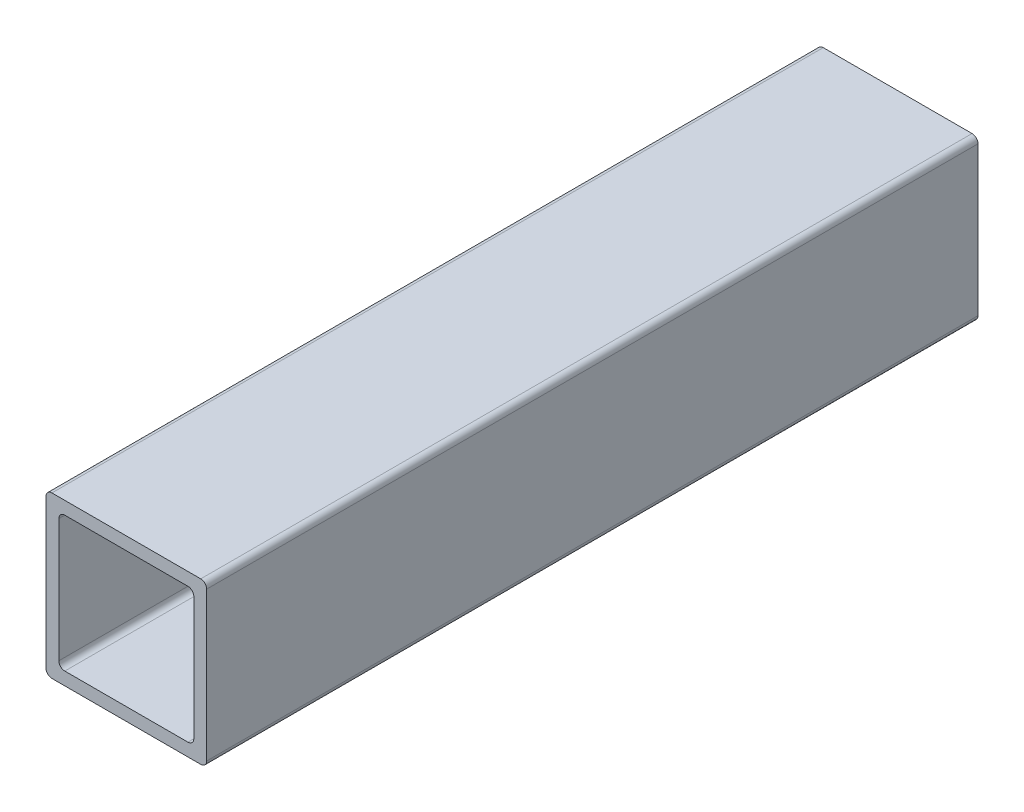
ISO-10303-21;
HEADER;
FILE_DESCRIPTION(('STEP AP214'),'2;1');
FILE_NAME('part.step','',(''),(''),'','','');
FILE_SCHEMA(('AUTOMOTIVE_DESIGN { 1 0 10303 214 1 1 1 1 }'));
ENDSEC;
DATA;
#1=APPLICATION_CONTEXT('core data for automotive mechanical design processes');
#2=APPLICATION_PROTOCOL_DEFINITION('international standard','automotive_design',2000,#1);
#3=PRODUCT_CONTEXT('',#1,'mechanical');
#4=PRODUCT('Part','Part','',(#3));
#5=PRODUCT_RELATED_PRODUCT_CATEGORY('part','',(#4));
#6=PRODUCT_DEFINITION_FORMATION('','',#4);
#7=PRODUCT_DEFINITION_CONTEXT('part definition',#1,'design');
#8=PRODUCT_DEFINITION('design','',#6,#7);
#9=PRODUCT_DEFINITION_SHAPE('','',#8);
#10=(LENGTH_UNIT() NAMED_UNIT(*) SI_UNIT(.MILLI.,.METRE.));
#11=(NAMED_UNIT(*) PLANE_ANGLE_UNIT() SI_UNIT($,.RADIAN.));
#12=(NAMED_UNIT(*) SI_UNIT($,.STERADIAN.) SOLID_ANGLE_UNIT());
#13=UNCERTAINTY_MEASURE_WITH_UNIT(LENGTH_MEASURE(1.E-05),#10,'distance_accuracy_value','');
#14=(GEOMETRIC_REPRESENTATION_CONTEXT(3) GLOBAL_UNCERTAINTY_ASSIGNED_CONTEXT((#13)) GLOBAL_UNIT_ASSIGNED_CONTEXT((#10,
#11,#12)) REPRESENTATION_CONTEXT('',''));
#15=CARTESIAN_POINT('',(0.,0.,0.));
#16=DIRECTION('',(0.,0.,1.));
#17=DIRECTION('',(1.,0.,0.));
#18=AXIS2_PLACEMENT_3D('',#15,#16,#17);
#19=CARTESIAN_POINT('',(23.153,23.153,240.));
#20=DIRECTION('',(0.,0.,-1.));
#21=DIRECTION('',(-1.,0.,0.));
#22=AXIS2_PLACEMENT_3D('',#19,#20,#21);
#23=PLANE('',#22);
#24=CARTESIAN_POINT('',(23.153,23.153,240.));
#25=DIRECTION('',(0.,0.,1.));
#26=DIRECTION('',(-1.,0.,0.));
#27=AXIS2_PLACEMENT_3D('',#24,#25,#26);
#28=CIRCLE('',#27,1.847);
#29=CARTESIAN_POINT('',(25.,23.153,240.));
#30=VERTEX_POINT('',#29);
#31=CARTESIAN_POINT('',(23.153,25.,240.));
#32=VERTEX_POINT('',#31);
#33=EDGE_CURVE('E195',#30,#32,#28,.T.);
#34=ORIENTED_EDGE('',*,*,#33,.T.);
#35=DIRECTION('',(-1.,0.,0.));
#36=VECTOR('',#35,1.);
#37=CARTESIAN_POINT('',(-23.153,25.,240.));
#38=LINE('',#37,#36);
#39=CARTESIAN_POINT('',(-23.153,25.,240.));
#40=VERTEX_POINT('',#39);
#41=EDGE_CURVE('E198',#32,#40,#38,.T.);
#42=ORIENTED_EDGE('',*,*,#41,.T.);
#43=CARTESIAN_POINT('',(-23.153,23.153,240.));
#44=DIRECTION('',(0.,0.,1.));
#45=DIRECTION('',(1.,0.,0.));
#46=AXIS2_PLACEMENT_3D('',#43,#44,#45);
#47=CIRCLE('',#46,1.847);
#48=CARTESIAN_POINT('',(-25.,23.153,240.));
#49=VERTEX_POINT('',#48);
#50=EDGE_CURVE('E201',#40,#49,#47,.T.);
#51=ORIENTED_EDGE('',*,*,#50,.T.);
#52=DIRECTION('',(0.,-1.,0.));
#53=VECTOR('',#52,1.);
#54=CARTESIAN_POINT('',(-25.,23.153,240.));
#55=LINE('',#54,#53);
#56=CARTESIAN_POINT('',(-25.,-23.153,240.));
#57=VERTEX_POINT('',#56);
#58=EDGE_CURVE('E203',#49,#57,#55,.T.);
#59=ORIENTED_EDGE('',*,*,#58,.T.);
#60=CARTESIAN_POINT('',(-23.153,-23.153,240.));
#61=DIRECTION('',(0.,0.,1.));
#62=DIRECTION('',(1.,0.,0.));
#63=AXIS2_PLACEMENT_3D('',#60,#61,#62);
#64=CIRCLE('',#63,1.847);
#65=CARTESIAN_POINT('',(-23.153,-25.,240.));
#66=VERTEX_POINT('',#65);
#67=EDGE_CURVE('E205',#57,#66,#64,.T.);
#68=ORIENTED_EDGE('',*,*,#67,.T.);
#69=DIRECTION('',(1.,0.,0.));
#70=VECTOR('',#69,1.);
#71=CARTESIAN_POINT('',(-23.153,-25.,240.));
#72=LINE('',#71,#70);
#73=CARTESIAN_POINT('',(23.153,-25.,240.));
#74=VERTEX_POINT('',#73);
#75=EDGE_CURVE('E207',#66,#74,#72,.T.);
#76=ORIENTED_EDGE('',*,*,#75,.T.);
#77=CARTESIAN_POINT('',(23.153,-23.153,240.));
#78=DIRECTION('',(0.,0.,1.));
#79=DIRECTION('',(1.,0.,0.));
#80=AXIS2_PLACEMENT_3D('',#77,#78,#79);
#81=CIRCLE('',#80,1.847);
#82=CARTESIAN_POINT('',(25.,-23.153,240.));
#83=VERTEX_POINT('',#82);
#84=EDGE_CURVE('E209',#74,#83,#81,.T.);
#85=ORIENTED_EDGE('',*,*,#84,.T.);
#86=DIRECTION('',(0.,1.,0.));
#87=VECTOR('',#86,1.);
#88=CARTESIAN_POINT('',(25.,23.153,240.));
#89=LINE('',#88,#87);
#90=EDGE_CURVE('E211',#83,#30,#89,.T.);
#91=ORIENTED_EDGE('',*,*,#90,.T.);
#92=EDGE_LOOP('',(#34,#42,#51,#59,#68,#76,#85,#91));
#93=FACE_BOUND('',#92,.T.);
#94=CARTESIAN_POINT('',(19.153,-19.153,240.));
#95=DIRECTION('',(0.,0.,1.));
#96=DIRECTION('',(1.,0.,0.));
#97=AXIS2_PLACEMENT_3D('',#94,#95,#96);
#98=CIRCLE('',#97,1.847);
#99=CARTESIAN_POINT('',(19.153,-21.,240.));
#100=VERTEX_POINT('',#99);
#101=CARTESIAN_POINT('',(21.,-19.153,240.));
#102=VERTEX_POINT('',#101);
#103=EDGE_CURVE('E130',#100,#102,#98,.T.);
#104=ORIENTED_EDGE('',*,*,#103,.F.);
#105=DIRECTION('',(1.,0.,0.));
#106=VECTOR('',#105,1.);
#107=CARTESIAN_POINT('',(-19.153,-21.,240.));
#108=LINE('',#107,#106);
#109=CARTESIAN_POINT('',(-19.153,-21.,240.));
#110=VERTEX_POINT('',#109);
#111=EDGE_CURVE('E163',#110,#100,#108,.T.);
#112=ORIENTED_EDGE('',*,*,#111,.F.);
#113=CARTESIAN_POINT('',(-19.153,-19.153,240.));
#114=DIRECTION('',(0.,0.,1.));
#115=DIRECTION('',(1.,0.,0.));
#116=AXIS2_PLACEMENT_3D('',#113,#114,#115);
#117=CIRCLE('',#116,1.847);
#118=CARTESIAN_POINT('',(-21.,-19.153,240.));
#119=VERTEX_POINT('',#118);
#120=EDGE_CURVE('E161',#119,#110,#117,.T.);
#121=ORIENTED_EDGE('',*,*,#120,.F.);
#122=DIRECTION('',(0.,-1.,0.));
#123=VECTOR('',#122,1.);
#124=CARTESIAN_POINT('',(-21.,19.153,240.));
#125=LINE('',#124,#123);
#126=CARTESIAN_POINT('',(-21.,19.153,240.));
#127=VERTEX_POINT('',#126);
#128=EDGE_CURVE('E159',#127,#119,#125,.T.);
#129=ORIENTED_EDGE('',*,*,#128,.F.);
#130=CARTESIAN_POINT('',(-19.153,19.153,240.));
#131=DIRECTION('',(0.,0.,1.));
#132=DIRECTION('',(1.,0.,0.));
#133=AXIS2_PLACEMENT_3D('',#130,#131,#132);
#134=CIRCLE('',#133,1.847);
#135=CARTESIAN_POINT('',(-19.153,21.,240.));
#136=VERTEX_POINT('',#135);
#137=EDGE_CURVE('E157',#136,#127,#134,.T.);
#138=ORIENTED_EDGE('',*,*,#137,.F.);
#139=DIRECTION('',(-1.,0.,0.));
#140=VECTOR('',#139,1.);
#141=CARTESIAN_POINT('',(-19.153,21.,240.));
#142=LINE('',#141,#140);
#143=CARTESIAN_POINT('',(19.153,21.,240.));
#144=VERTEX_POINT('',#143);
#145=EDGE_CURVE('E153',#144,#136,#142,.T.);
#146=ORIENTED_EDGE('',*,*,#145,.F.);
#147=CARTESIAN_POINT('',(19.153,19.153,240.));
#148=DIRECTION('',(0.,0.,1.));
#149=DIRECTION('',(-1.,0.,0.));
#150=AXIS2_PLACEMENT_3D('',#147,#148,#149);
#151=CIRCLE('',#150,1.847);
#152=CARTESIAN_POINT('',(21.,19.153,240.));
#153=VERTEX_POINT('',#152);
#154=EDGE_CURVE('E151',#153,#144,#151,.T.);
#155=ORIENTED_EDGE('',*,*,#154,.F.);
#156=DIRECTION('',(0.,1.,0.));
#157=VECTOR('',#156,1.);
#158=CARTESIAN_POINT('',(21.,19.153,240.));
#159=LINE('',#158,#157);
#160=EDGE_CURVE('E138',#102,#153,#159,.T.);
#161=ORIENTED_EDGE('',*,*,#160,.F.);
#162=EDGE_LOOP('',(#104,#112,#121,#129,#138,#146,#155,#161));
#163=FACE_BOUND('',#162,.T.);
#164=ADVANCED_FACE('F17',(#93,#163),#23,.F.);
#165=CARTESIAN_POINT('',(23.153,23.153,0.));
#166=DIRECTION('',(0.,0.,-1.));
#167=DIRECTION('',(-1.,0.,0.));
#168=AXIS2_PLACEMENT_3D('',#165,#166,#167);
#169=PLANE('',#168);
#170=CARTESIAN_POINT('',(23.153,23.153,0.));
#171=DIRECTION('',(0.,0.,1.));
#172=DIRECTION('',(-1.,0.,0.));
#173=AXIS2_PLACEMENT_3D('',#170,#171,#172);
#174=CIRCLE('',#173,1.847);
#175=CARTESIAN_POINT('',(25.,23.153,0.));
#176=VERTEX_POINT('',#175);
#177=CARTESIAN_POINT('',(23.153,25.,0.));
#178=VERTEX_POINT('',#177);
#179=EDGE_CURVE('E146',#176,#178,#174,.T.);
#180=ORIENTED_EDGE('',*,*,#179,.F.);
#181=DIRECTION('',(0.,1.,0.));
#182=VECTOR('',#181,1.);
#183=CARTESIAN_POINT('',(25.,23.153,0.));
#184=LINE('',#183,#182);
#185=CARTESIAN_POINT('',(25.,-23.153,0.));
#186=VERTEX_POINT('',#185);
#187=EDGE_CURVE('E199',#186,#176,#184,.T.);
#188=ORIENTED_EDGE('',*,*,#187,.F.);
#189=CARTESIAN_POINT('',(23.153,-23.153,0.));
#190=DIRECTION('',(0.,0.,1.));
#191=DIRECTION('',(1.,0.,0.));
#192=AXIS2_PLACEMENT_3D('',#189,#190,#191);
#193=CIRCLE('',#192,1.847);
#194=CARTESIAN_POINT('',(23.153,-25.,0.));
#195=VERTEX_POINT('',#194);
#196=EDGE_CURVE('E226',#195,#186,#193,.T.);
#197=ORIENTED_EDGE('',*,*,#196,.F.);
#198=DIRECTION('',(1.,0.,0.));
#199=VECTOR('',#198,1.);
#200=CARTESIAN_POINT('',(-23.153,-25.,0.));
#201=LINE('',#200,#199);
#202=CARTESIAN_POINT('',(-23.153,-25.,0.));
#203=VERTEX_POINT('',#202);
#204=EDGE_CURVE('E224',#203,#195,#201,.T.);
#205=ORIENTED_EDGE('',*,*,#204,.F.);
#206=CARTESIAN_POINT('',(-23.153,-23.153,0.));
#207=DIRECTION('',(0.,0.,1.));
#208=DIRECTION('',(1.,0.,0.));
#209=AXIS2_PLACEMENT_3D('',#206,#207,#208);
#210=CIRCLE('',#209,1.847);
#211=CARTESIAN_POINT('',(-25.,-23.153,0.));
#212=VERTEX_POINT('',#211);
#213=EDGE_CURVE('E222',#212,#203,#210,.T.);
#214=ORIENTED_EDGE('',*,*,#213,.F.);
#215=DIRECTION('',(0.,-1.,0.));
#216=VECTOR('',#215,1.);
#217=CARTESIAN_POINT('',(-25.,23.153,0.));
#218=LINE('',#217,#216);
#219=CARTESIAN_POINT('',(-25.,23.153,0.));
#220=VERTEX_POINT('',#219);
#221=EDGE_CURVE('E220',#220,#212,#218,.T.);
#222=ORIENTED_EDGE('',*,*,#221,.F.);
#223=CARTESIAN_POINT('',(-23.153,23.153,0.));
#224=DIRECTION('',(0.,0.,1.));
#225=DIRECTION('',(1.,0.,0.));
#226=AXIS2_PLACEMENT_3D('',#223,#224,#225);
#227=CIRCLE('',#226,1.847);
#228=CARTESIAN_POINT('',(-23.153,25.,0.));
#229=VERTEX_POINT('',#228);
#230=EDGE_CURVE('E218',#229,#220,#227,.T.);
#231=ORIENTED_EDGE('',*,*,#230,.F.);
#232=DIRECTION('',(-1.,0.,0.));
#233=VECTOR('',#232,1.);
#234=CARTESIAN_POINT('',(-23.153,25.,0.));
#235=LINE('',#234,#233);
#236=EDGE_CURVE('E216',#178,#229,#235,.T.);
#237=ORIENTED_EDGE('',*,*,#236,.F.);
#238=EDGE_LOOP('',(#180,#188,#197,#205,#214,#222,#231,#237));
#239=FACE_BOUND('',#238,.T.);
#240=DIRECTION('',(1.,0.,0.));
#241=VECTOR('',#240,1.);
#242=CARTESIAN_POINT('',(-19.153,-21.,0.));
#243=LINE('',#242,#241);
#244=CARTESIAN_POINT('',(-19.153,-21.,0.));
#245=VERTEX_POINT('',#244);
#246=CARTESIAN_POINT('',(19.153,-21.,0.));
#247=VERTEX_POINT('',#246);
#248=EDGE_CURVE('E139',#245,#247,#243,.T.);
#249=ORIENTED_EDGE('',*,*,#248,.T.);
#250=CARTESIAN_POINT('',(19.153,-19.153,0.));
#251=DIRECTION('',(0.,0.,1.));
#252=DIRECTION('',(1.,0.,0.));
#253=AXIS2_PLACEMENT_3D('',#250,#251,#252);
#254=CIRCLE('',#253,1.847);
#255=CARTESIAN_POINT('',(21.,-19.153,0.));
#256=VERTEX_POINT('',#255);
#257=EDGE_CURVE('E40',#247,#256,#254,.T.);
#258=ORIENTED_EDGE('',*,*,#257,.T.);
#259=DIRECTION('',(0.,1.,0.));
#260=VECTOR('',#259,1.);
#261=CARTESIAN_POINT('',(21.,19.153,0.));
#262=LINE('',#261,#260);
#263=CARTESIAN_POINT('',(21.,19.153,0.));
#264=VERTEX_POINT('',#263);
#265=EDGE_CURVE('E145',#256,#264,#262,.T.);
#266=ORIENTED_EDGE('',*,*,#265,.T.);
#267=CARTESIAN_POINT('',(19.153,19.153,0.));
#268=DIRECTION('',(0.,0.,1.));
#269=DIRECTION('',(-1.,0.,0.));
#270=AXIS2_PLACEMENT_3D('',#267,#268,#269);
#271=CIRCLE('',#270,1.847);
#272=CARTESIAN_POINT('',(19.153,21.,0.));
#273=VERTEX_POINT('',#272);
#274=EDGE_CURVE('E167',#264,#273,#271,.T.);
#275=ORIENTED_EDGE('',*,*,#274,.T.);
#276=DIRECTION('',(-1.,0.,0.));
#277=VECTOR('',#276,1.);
#278=CARTESIAN_POINT('',(-19.153,21.,0.));
#279=LINE('',#278,#277);
#280=CARTESIAN_POINT('',(-19.153,21.,0.));
#281=VERTEX_POINT('',#280);
#282=EDGE_CURVE('E170',#273,#281,#279,.T.);
#283=ORIENTED_EDGE('',*,*,#282,.T.);
#284=CARTESIAN_POINT('',(-19.153,19.153,0.));
#285=DIRECTION('',(0.,0.,1.));
#286=DIRECTION('',(1.,0.,0.));
#287=AXIS2_PLACEMENT_3D('',#284,#285,#286);
#288=CIRCLE('',#287,1.847);
#289=CARTESIAN_POINT('',(-21.,19.153,0.));
#290=VERTEX_POINT('',#289);
#291=EDGE_CURVE('E173',#281,#290,#288,.T.);
#292=ORIENTED_EDGE('',*,*,#291,.T.);
#293=DIRECTION('',(0.,-1.,0.));
#294=VECTOR('',#293,1.);
#295=CARTESIAN_POINT('',(-21.,19.153,0.));
#296=LINE('',#295,#294);
#297=CARTESIAN_POINT('',(-21.,-19.153,0.));
#298=VERTEX_POINT('',#297);
#299=EDGE_CURVE('E176',#290,#298,#296,.T.);
#300=ORIENTED_EDGE('',*,*,#299,.T.);
#301=CARTESIAN_POINT('',(-19.153,-19.153,0.));
#302=DIRECTION('',(0.,0.,1.));
#303=DIRECTION('',(1.,0.,0.));
#304=AXIS2_PLACEMENT_3D('',#301,#302,#303);
#305=CIRCLE('',#304,1.847);
#306=EDGE_CURVE('E179',#298,#245,#305,.T.);
#307=ORIENTED_EDGE('',*,*,#306,.T.);
#308=EDGE_LOOP('',(#249,#258,#266,#275,#283,#292,#300,#307));
#309=FACE_BOUND('',#308,.T.);
#310=ADVANCED_FACE('F256',(#239,#309),#169,.T.);
#311=CARTESIAN_POINT('',(23.153,23.153,240.));
#312=DIRECTION('',(0.,0.,-1.));
#313=DIRECTION('',(-1.,0.,0.));
#314=AXIS2_PLACEMENT_3D('',#311,#312,#313);
#315=CYLINDRICAL_SURFACE('',#314,1.847);
#316=ORIENTED_EDGE('',*,*,#179,.T.);
#317=DIRECTION('',(0.,0.,-1.));
#318=VECTOR('',#317,1.);
#319=CARTESIAN_POINT('',(23.153,25.,240.));
#320=LINE('',#319,#318);
#321=EDGE_CURVE('E11',#32,#178,#320,.T.);
#322=ORIENTED_EDGE('',*,*,#321,.F.);
#323=ORIENTED_EDGE('',*,*,#33,.F.);
#324=DIRECTION('',(0.,0.,-1.));
#325=VECTOR('',#324,1.);
#326=CARTESIAN_POINT('',(25.,23.153,240.));
#327=LINE('',#326,#325);
#328=EDGE_CURVE('E213',#30,#176,#327,.T.);
#329=ORIENTED_EDGE('',*,*,#328,.T.);
#330=EDGE_LOOP('',(#316,#322,#323,#329));
#331=FACE_BOUND('',#330,.T.);
#332=ADVANCED_FACE('F19',(#331),#315,.T.);
#333=CARTESIAN_POINT('',(-23.153,25.,240.));
#334=DIRECTION('',(0.,-1.,0.));
#335=DIRECTION('',(0.,0.,-1.));
#336=AXIS2_PLACEMENT_3D('',#333,#334,#335);
#337=PLANE('',#336);
#338=ORIENTED_EDGE('',*,*,#236,.T.);
#339=DIRECTION('',(0.,0.,-1.));
#340=VECTOR('',#339,1.);
#341=CARTESIAN_POINT('',(-23.153,25.,240.));
#342=LINE('',#341,#340);
#343=EDGE_CURVE('E25',#40,#229,#342,.T.);
#344=ORIENTED_EDGE('',*,*,#343,.F.);
#345=ORIENTED_EDGE('',*,*,#41,.F.);
#346=ORIENTED_EDGE('',*,*,#321,.T.);
#347=EDGE_LOOP('',(#338,#344,#345,#346));
#348=FACE_BOUND('',#347,.T.);
#349=ADVANCED_FACE('F273',(#348),#337,.F.);
#350=CARTESIAN_POINT('',(-23.153,23.153,240.));
#351=DIRECTION('',(0.,0.,-1.));
#352=DIRECTION('',(-1.,0.,0.));
#353=AXIS2_PLACEMENT_3D('',#350,#351,#352);
#354=CYLINDRICAL_SURFACE('',#353,1.847);
#355=ORIENTED_EDGE('',*,*,#230,.T.);
#356=DIRECTION('',(0.,0.,-1.));
#357=VECTOR('',#356,1.);
#358=CARTESIAN_POINT('',(-25.,23.153,240.));
#359=LINE('',#358,#357);
#360=EDGE_CURVE('E243',#49,#220,#359,.T.);
#361=ORIENTED_EDGE('',*,*,#360,.F.);
#362=ORIENTED_EDGE('',*,*,#50,.F.);
#363=ORIENTED_EDGE('',*,*,#343,.T.);
#364=EDGE_LOOP('',(#355,#361,#362,#363));
#365=FACE_BOUND('',#364,.T.);
#366=ADVANCED_FACE('F250',(#365),#354,.T.);
#367=CARTESIAN_POINT('',(-25.,23.153,240.));
#368=DIRECTION('',(1.,0.,0.));
#369=DIRECTION('',(0.,0.,-1.));
#370=AXIS2_PLACEMENT_3D('',#367,#368,#369);
#371=PLANE('',#370);
#372=ORIENTED_EDGE('',*,*,#221,.T.);
#373=DIRECTION('',(0.,0.,-1.));
#374=VECTOR('',#373,1.);
#375=CARTESIAN_POINT('',(-25.,-23.153,240.));
#376=LINE('',#375,#374);
#377=EDGE_CURVE('E240',#57,#212,#376,.T.);
#378=ORIENTED_EDGE('',*,*,#377,.F.);
#379=ORIENTED_EDGE('',*,*,#58,.F.);
#380=ORIENTED_EDGE('',*,*,#360,.T.);
#381=EDGE_LOOP('',(#372,#378,#379,#380));
#382=FACE_BOUND('',#381,.T.);
#383=ADVANCED_FACE('F262',(#382),#371,.F.);
#384=CARTESIAN_POINT('',(-23.153,-23.153,240.));
#385=DIRECTION('',(0.,0.,-1.));
#386=DIRECTION('',(-1.,0.,0.));
#387=AXIS2_PLACEMENT_3D('',#384,#385,#386);
#388=CYLINDRICAL_SURFACE('',#387,1.847);
#389=ORIENTED_EDGE('',*,*,#213,.T.);
#390=DIRECTION('',(0.,0.,-1.));
#391=VECTOR('',#390,1.);
#392=CARTESIAN_POINT('',(-23.153,-25.,240.));
#393=LINE('',#392,#391);
#394=EDGE_CURVE('E237',#66,#203,#393,.T.);
#395=ORIENTED_EDGE('',*,*,#394,.F.);
#396=ORIENTED_EDGE('',*,*,#67,.F.);
#397=ORIENTED_EDGE('',*,*,#377,.T.);
#398=EDGE_LOOP('',(#389,#395,#396,#397));
#399=FACE_BOUND('',#398,.T.);
#400=ADVANCED_FACE('F266',(#399),#388,.T.);
#401=CARTESIAN_POINT('',(-23.153,-25.,240.));
#402=DIRECTION('',(0.,1.,0.));
#403=DIRECTION('',(0.,0.,1.));
#404=AXIS2_PLACEMENT_3D('',#401,#402,#403);
#405=PLANE('',#404);
#406=ORIENTED_EDGE('',*,*,#204,.T.);
#407=DIRECTION('',(0.,0.,-1.));
#408=VECTOR('',#407,1.);
#409=CARTESIAN_POINT('',(23.153,-25.,240.));
#410=LINE('',#409,#408);
#411=EDGE_CURVE('E234',#74,#195,#410,.T.);
#412=ORIENTED_EDGE('',*,*,#411,.F.);
#413=ORIENTED_EDGE('',*,*,#75,.F.);
#414=ORIENTED_EDGE('',*,*,#394,.T.);
#415=EDGE_LOOP('',(#406,#412,#413,#414));
#416=FACE_BOUND('',#415,.T.);
#417=ADVANCED_FACE('F286',(#416),#405,.F.);
#418=CARTESIAN_POINT('',(23.153,-23.153,240.));
#419=DIRECTION('',(0.,0.,-1.));
#420=DIRECTION('',(-1.,0.,0.));
#421=AXIS2_PLACEMENT_3D('',#418,#419,#420);
#422=CYLINDRICAL_SURFACE('',#421,1.847);
#423=ORIENTED_EDGE('',*,*,#196,.T.);
#424=DIRECTION('',(0.,0.,-1.));
#425=VECTOR('',#424,1.);
#426=CARTESIAN_POINT('',(25.,-23.153,240.));
#427=LINE('',#426,#425);
#428=EDGE_CURVE('E231',#83,#186,#427,.T.);
#429=ORIENTED_EDGE('',*,*,#428,.F.);
#430=ORIENTED_EDGE('',*,*,#84,.F.);
#431=ORIENTED_EDGE('',*,*,#411,.T.);
#432=EDGE_LOOP('',(#423,#429,#430,#431));
#433=FACE_BOUND('',#432,.T.);
#434=ADVANCED_FACE('F284',(#433),#422,.T.);
#435=CARTESIAN_POINT('',(25.,23.153,240.));
#436=DIRECTION('',(-1.,0.,0.));
#437=DIRECTION('',(0.,0.,1.));
#438=AXIS2_PLACEMENT_3D('',#435,#436,#437);
#439=PLANE('',#438);
#440=ORIENTED_EDGE('',*,*,#187,.T.);
#441=ORIENTED_EDGE('',*,*,#328,.F.);
#442=ORIENTED_EDGE('',*,*,#90,.F.);
#443=ORIENTED_EDGE('',*,*,#428,.T.);
#444=EDGE_LOOP('',(#440,#441,#442,#443));
#445=FACE_BOUND('',#444,.T.);
#446=ADVANCED_FACE('F279',(#445),#439,.F.);
#447=CARTESIAN_POINT('',(19.153,-19.153,240.));
#448=DIRECTION('',(0.,0.,-1.));
#449=DIRECTION('',(-1.,0.,0.));
#450=AXIS2_PLACEMENT_3D('',#447,#448,#449);
#451=CYLINDRICAL_SURFACE('',#450,1.847);
#452=ORIENTED_EDGE('',*,*,#257,.F.);
#453=DIRECTION('',(0.,0.,-1.));
#454=VECTOR('',#453,1.);
#455=CARTESIAN_POINT('',(19.153,-21.,240.));
#456=LINE('',#455,#454);
#457=EDGE_CURVE('E134',#100,#247,#456,.T.);
#458=ORIENTED_EDGE('',*,*,#457,.F.);
#459=ORIENTED_EDGE('',*,*,#103,.T.);
#460=DIRECTION('',(0.,0.,-1.));
#461=VECTOR('',#460,1.);
#462=CARTESIAN_POINT('',(21.,-19.153,240.));
#463=LINE('',#462,#461);
#464=EDGE_CURVE('E133',#102,#256,#463,.T.);
#465=ORIENTED_EDGE('',*,*,#464,.T.);
#466=EDGE_LOOP('',(#452,#458,#459,#465));
#467=FACE_BOUND('',#466,.T.);
#468=ADVANCED_FACE('F132',(#467),#451,.F.);
#469=CARTESIAN_POINT('',(21.,19.153,240.));
#470=DIRECTION('',(-1.,0.,0.));
#471=DIRECTION('',(0.,-1.,0.));
#472=AXIS2_PLACEMENT_3D('',#469,#470,#471);
#473=PLANE('',#472);
#474=ORIENTED_EDGE('',*,*,#265,.F.);
#475=ORIENTED_EDGE('',*,*,#464,.F.);
#476=ORIENTED_EDGE('',*,*,#160,.T.);
#477=DIRECTION('',(0.,0.,-1.));
#478=VECTOR('',#477,1.);
#479=CARTESIAN_POINT('',(21.,19.153,240.));
#480=LINE('',#479,#478);
#481=EDGE_CURVE('E147',#153,#264,#480,.T.);
#482=ORIENTED_EDGE('',*,*,#481,.T.);
#483=EDGE_LOOP('',(#474,#475,#476,#482));
#484=FACE_BOUND('',#483,.T.);
#485=ADVANCED_FACE('F142',(#484),#473,.T.);
#486=CARTESIAN_POINT('',(19.153,19.153,240.));
#487=DIRECTION('',(0.,0.,-1.));
#488=DIRECTION('',(-1.,0.,0.));
#489=AXIS2_PLACEMENT_3D('',#486,#487,#488);
#490=CYLINDRICAL_SURFACE('',#489,1.847);
#491=ORIENTED_EDGE('',*,*,#274,.F.);
#492=ORIENTED_EDGE('',*,*,#481,.F.);
#493=ORIENTED_EDGE('',*,*,#154,.T.);
#494=DIRECTION('',(0.,0.,-1.));
#495=VECTOR('',#494,1.);
#496=CARTESIAN_POINT('',(19.153,21.,240.));
#497=LINE('',#496,#495);
#498=EDGE_CURVE('E192',#144,#273,#497,.T.);
#499=ORIENTED_EDGE('',*,*,#498,.T.);
#500=EDGE_LOOP('',(#491,#492,#493,#499));
#501=FACE_BOUND('',#500,.T.);
#502=ADVANCED_FACE('F316',(#501),#490,.F.);
#503=CARTESIAN_POINT('',(-19.153,21.,240.));
#504=DIRECTION('',(0.,-1.,0.));
#505=DIRECTION('',(1.,0.,0.));
#506=AXIS2_PLACEMENT_3D('',#503,#504,#505);
#507=PLANE('',#506);
#508=ORIENTED_EDGE('',*,*,#282,.F.);
#509=ORIENTED_EDGE('',*,*,#498,.F.);
#510=ORIENTED_EDGE('',*,*,#145,.T.);
#511=DIRECTION('',(0.,0.,-1.));
#512=VECTOR('',#511,1.);
#513=CARTESIAN_POINT('',(-19.153,21.,240.));
#514=LINE('',#513,#512);
#515=EDGE_CURVE('E190',#136,#281,#514,.T.);
#516=ORIENTED_EDGE('',*,*,#515,.T.);
#517=EDGE_LOOP('',(#508,#509,#510,#516));
#518=FACE_BOUND('',#517,.T.);
#519=ADVANCED_FACE('F321',(#518),#507,.T.);
#520=CARTESIAN_POINT('',(-19.153,19.153,240.));
#521=DIRECTION('',(0.,0.,-1.));
#522=DIRECTION('',(-1.,0.,0.));
#523=AXIS2_PLACEMENT_3D('',#520,#521,#522);
#524=CYLINDRICAL_SURFACE('',#523,1.847);
#525=ORIENTED_EDGE('',*,*,#291,.F.);
#526=ORIENTED_EDGE('',*,*,#515,.F.);
#527=ORIENTED_EDGE('',*,*,#137,.T.);
#528=DIRECTION('',(0.,0.,-1.));
#529=VECTOR('',#528,1.);
#530=CARTESIAN_POINT('',(-21.,19.153,240.));
#531=LINE('',#530,#529);
#532=EDGE_CURVE('E188',#127,#290,#531,.T.);
#533=ORIENTED_EDGE('',*,*,#532,.T.);
#534=EDGE_LOOP('',(#525,#526,#527,#533));
#535=FACE_BOUND('',#534,.T.);
#536=ADVANCED_FACE('F327',(#535),#524,.F.);
#537=CARTESIAN_POINT('',(-21.,19.153,240.));
#538=DIRECTION('',(1.,0.,0.));
#539=DIRECTION('',(0.,0.,-1.));
#540=AXIS2_PLACEMENT_3D('',#537,#538,#539);
#541=PLANE('',#540);
#542=ORIENTED_EDGE('',*,*,#299,.F.);
#543=ORIENTED_EDGE('',*,*,#532,.F.);
#544=ORIENTED_EDGE('',*,*,#128,.T.);
#545=DIRECTION('',(0.,0.,-1.));
#546=VECTOR('',#545,1.);
#547=CARTESIAN_POINT('',(-21.,-19.153,240.));
#548=LINE('',#547,#546);
#549=EDGE_CURVE('E186',#119,#298,#548,.T.);
#550=ORIENTED_EDGE('',*,*,#549,.T.);
#551=EDGE_LOOP('',(#542,#543,#544,#550));
#552=FACE_BOUND('',#551,.T.);
#553=ADVANCED_FACE('F331',(#552),#541,.T.);
#554=CARTESIAN_POINT('',(-19.153,-19.153,240.));
#555=DIRECTION('',(0.,0.,-1.));
#556=DIRECTION('',(-1.,0.,0.));
#557=AXIS2_PLACEMENT_3D('',#554,#555,#556);
#558=CYLINDRICAL_SURFACE('',#557,1.847);
#559=ORIENTED_EDGE('',*,*,#306,.F.);
#560=ORIENTED_EDGE('',*,*,#549,.F.);
#561=ORIENTED_EDGE('',*,*,#120,.T.);
#562=DIRECTION('',(0.,0.,-1.));
#563=VECTOR('',#562,1.);
#564=CARTESIAN_POINT('',(-19.153,-21.,240.));
#565=LINE('',#564,#563);
#566=EDGE_CURVE('E32',#110,#245,#565,.T.);
#567=ORIENTED_EDGE('',*,*,#566,.T.);
#568=EDGE_LOOP('',(#559,#560,#561,#567));
#569=FACE_BOUND('',#568,.T.);
#570=ADVANCED_FACE('F335',(#569),#558,.F.);
#571=CARTESIAN_POINT('',(-19.153,-21.,240.));
#572=DIRECTION('',(0.,1.,0.));
#573=DIRECTION('',(-1.,0.,0.));
#574=AXIS2_PLACEMENT_3D('',#571,#572,#573);
#575=PLANE('',#574);
#576=ORIENTED_EDGE('',*,*,#248,.F.);
#577=ORIENTED_EDGE('',*,*,#566,.F.);
#578=ORIENTED_EDGE('',*,*,#111,.T.);
#579=ORIENTED_EDGE('',*,*,#457,.T.);
#580=EDGE_LOOP('',(#576,#577,#578,#579));
#581=FACE_BOUND('',#580,.T.);
#582=ADVANCED_FACE('F339',(#581),#575,.T.);
#583=CLOSED_SHELL('',(#164,#310,#332,#349,#366,#383,#400,#417,#434,#446,#468,#485,#502,#519,
#536,#553,#570,#582));
#584=MANIFOLD_SOLID_BREP('B1',#583);
#585=ADVANCED_BREP_SHAPE_REPRESENTATION('',(#18,#584),#14);
#586=SHAPE_DEFINITION_REPRESENTATION(#9,#585);
ENDSEC;
END-ISO-10303-21;
